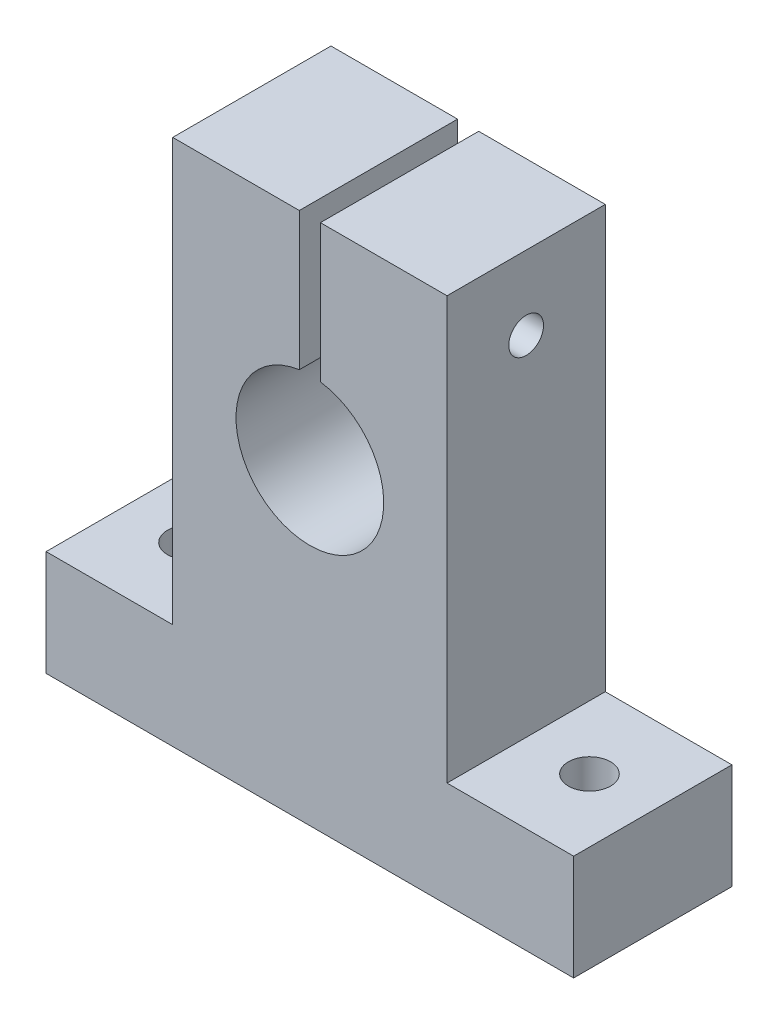
ISO-10303-21;
HEADER;
FILE_DESCRIPTION(('STEP AP214'),'2;1');
FILE_NAME('part.step','',(''),(''),'','','');
FILE_SCHEMA(('AUTOMOTIVE_DESIGN { 1 0 10303 214 1 1 1 1 }'));
ENDSEC;
DATA;
#1=APPLICATION_CONTEXT('core data for automotive mechanical design processes');
#2=APPLICATION_PROTOCOL_DEFINITION('international standard','automotive_design',2000,#1);
#3=PRODUCT_CONTEXT('',#1,'mechanical');
#4=PRODUCT('Part','Part','',(#3));
#5=PRODUCT_RELATED_PRODUCT_CATEGORY('part','',(#4));
#6=PRODUCT_DEFINITION_FORMATION('','',#4);
#7=PRODUCT_DEFINITION_CONTEXT('part definition',#1,'design');
#8=PRODUCT_DEFINITION('design','',#6,#7);
#9=PRODUCT_DEFINITION_SHAPE('','',#8);
#10=(LENGTH_UNIT() NAMED_UNIT(*) SI_UNIT(.MILLI.,.METRE.));
#11=(NAMED_UNIT(*) PLANE_ANGLE_UNIT() SI_UNIT($,.RADIAN.));
#12=(NAMED_UNIT(*) SI_UNIT($,.STERADIAN.) SOLID_ANGLE_UNIT());
#13=UNCERTAINTY_MEASURE_WITH_UNIT(LENGTH_MEASURE(1.E-05),#10,'distance_accuracy_value','');
#14=(GEOMETRIC_REPRESENTATION_CONTEXT(3) GLOBAL_UNCERTAINTY_ASSIGNED_CONTEXT((#13)) GLOBAL_UNIT_ASSIGNED_CONTEXT((#10,
#11,#12)) REPRESENTATION_CONTEXT('',''));
#15=CARTESIAN_POINT('',(0.,0.,0.));
#16=DIRECTION('',(0.,0.,1.));
#17=DIRECTION('',(1.,0.,0.));
#18=AXIS2_PLACEMENT_3D('',#15,#16,#17);
#19=CARTESIAN_POINT('',(0.,-40.,15.));
#20=DIRECTION('',(-1.,0.,0.));
#21=DIRECTION('',(0.,0.,1.));
#22=AXIS2_PLACEMENT_3D('',#19,#20,#21);
#23=PLANE('',#22);
#24=DIRECTION('',(0.,1.,0.));
#25=VECTOR('',#24,1.);
#26=CARTESIAN_POINT('',(0.,-40.,0.));
#27=LINE('',#26,#25);
#28=CARTESIAN_POINT('',(0.,-40.,0.));
#29=VERTEX_POINT('',#28);
#30=CARTESIAN_POINT('',(0.,0.,0.));
#31=VERTEX_POINT('',#30);
#32=EDGE_CURVE('E174',#29,#31,#27,.T.);
#33=ORIENTED_EDGE('',*,*,#32,.T.);
#34=DIRECTION('',(0.,0.,-1.));
#35=VECTOR('',#34,1.);
#36=CARTESIAN_POINT('',(0.,0.,15.));
#37=LINE('',#36,#35);
#38=CARTESIAN_POINT('',(0.,0.,15.));
#39=VERTEX_POINT('',#38);
#40=EDGE_CURVE('E210',#39,#31,#37,.T.);
#41=ORIENTED_EDGE('',*,*,#40,.F.);
#42=DIRECTION('',(0.,1.,0.));
#43=VECTOR('',#42,1.);
#44=CARTESIAN_POINT('',(0.,-40.,15.));
#45=LINE('',#44,#43);
#46=CARTESIAN_POINT('',(0.,-40.,15.));
#47=VERTEX_POINT('',#46);
#48=EDGE_CURVE('E233',#47,#39,#45,.T.);
#49=ORIENTED_EDGE('',*,*,#48,.F.);
#50=DIRECTION('',(0.,0.,-1.));
#51=VECTOR('',#50,1.);
#52=CARTESIAN_POINT('',(0.,-40.,15.));
#53=LINE('',#52,#51);
#54=EDGE_CURVE('E56',#47,#29,#53,.T.);
#55=ORIENTED_EDGE('',*,*,#54,.T.);
#56=EDGE_LOOP('',(#33,#41,#49,#55));
#57=FACE_BOUND('',#56,.T.);
#58=CARTESIAN_POINT('',(0.,-7.,7.5));
#59=DIRECTION('',(1.,0.,0.));
#60=DIRECTION('',(0.,0.,-1.));
#61=AXIS2_PLACEMENT_3D('',#58,#59,#60);
#62=CIRCLE('',#61,1.65);
#63=CARTESIAN_POINT('',(0.,-7.,5.85));
#64=VERTEX_POINT('',#63);
#65=EDGE_CURVE('E327',#64,#64,#62,.T.);
#66=ORIENTED_EDGE('',*,*,#65,.F.);
#67=EDGE_LOOP('',(#66));
#68=FACE_BOUND('',#67,.T.);
#69=ADVANCED_FACE('F46',(#57,#68),#23,.F.);
#70=CARTESIAN_POINT('',(12.,-50.,15.));
#71=DIRECTION('',(-1.,0.,0.));
#72=DIRECTION('',(0.,0.,1.));
#73=AXIS2_PLACEMENT_3D('',#70,#71,#72);
#74=PLANE('',#73);
#75=DIRECTION('',(0.,1.,0.));
#76=VECTOR('',#75,1.);
#77=CARTESIAN_POINT('',(12.,-50.,0.));
#78=LINE('',#77,#76);
#79=CARTESIAN_POINT('',(12.,-50.,0.));
#80=VERTEX_POINT('',#79);
#81=CARTESIAN_POINT('',(12.,-40.,0.));
#82=VERTEX_POINT('',#81);
#83=EDGE_CURVE('E169',#80,#82,#78,.T.);
#84=ORIENTED_EDGE('',*,*,#83,.T.);
#85=DIRECTION('',(0.,0.,-1.));
#86=VECTOR('',#85,1.);
#87=CARTESIAN_POINT('',(12.,-40.,15.));
#88=LINE('',#87,#86);
#89=CARTESIAN_POINT('',(12.,-40.,15.));
#90=VERTEX_POINT('',#89);
#91=EDGE_CURVE('E13',#90,#82,#88,.T.);
#92=ORIENTED_EDGE('',*,*,#91,.F.);
#93=DIRECTION('',(0.,1.,0.));
#94=VECTOR('',#93,1.);
#95=CARTESIAN_POINT('',(12.,-50.,15.));
#96=LINE('',#95,#94);
#97=CARTESIAN_POINT('',(12.,-50.,15.));
#98=VERTEX_POINT('',#97);
#99=EDGE_CURVE('E191',#98,#90,#96,.T.);
#100=ORIENTED_EDGE('',*,*,#99,.F.);
#101=DIRECTION('',(0.,0.,-1.));
#102=VECTOR('',#101,1.);
#103=CARTESIAN_POINT('',(12.,-50.,15.));
#104=LINE('',#103,#102);
#105=EDGE_CURVE('E165',#98,#80,#104,.T.);
#106=ORIENTED_EDGE('',*,*,#105,.T.);
#107=EDGE_LOOP('',(#84,#92,#100,#106));
#108=FACE_BOUND('',#107,.T.);
#109=ADVANCED_FACE('F48',(#108),#74,.F.);
#110=CARTESIAN_POINT('',(12.,-40.,15.));
#111=DIRECTION('',(0.,-1.,0.));
#112=DIRECTION('',(0.,0.,-1.));
#113=AXIS2_PLACEMENT_3D('',#110,#111,#112);
#114=PLANE('',#113);
#115=CARTESIAN_POINT('',(6.,-40.,7.5));
#116=DIRECTION('',(0.,1.,0.));
#117=DIRECTION('',(0.,0.,1.));
#118=AXIS2_PLACEMENT_3D('',#115,#116,#117);
#119=CIRCLE('',#118,2.);
#120=CARTESIAN_POINT('',(6.,-40.,9.5));
#121=VERTEX_POINT('',#120);
#122=EDGE_CURVE('E216',#121,#121,#119,.T.);
#123=ORIENTED_EDGE('',*,*,#122,.F.);
#124=EDGE_LOOP('',(#123));
#125=FACE_BOUND('',#124,.T.);
#126=DIRECTION('',(-1.,0.,0.));
#127=VECTOR('',#126,1.);
#128=CARTESIAN_POINT('',(12.,-40.,0.));
#129=LINE('',#128,#127);
#130=EDGE_CURVE('E172',#82,#29,#129,.T.);
#131=ORIENTED_EDGE('',*,*,#130,.T.);
#132=ORIENTED_EDGE('',*,*,#54,.F.);
#133=DIRECTION('',(-1.,0.,0.));
#134=VECTOR('',#133,1.);
#135=CARTESIAN_POINT('',(12.,-40.,15.));
#136=LINE('',#135,#134);
#137=EDGE_CURVE('E120',#90,#47,#136,.T.);
#138=ORIENTED_EDGE('',*,*,#137,.F.);
#139=ORIENTED_EDGE('',*,*,#91,.T.);
#140=EDGE_LOOP('',(#131,#132,#138,#139));
#141=FACE_BOUND('',#140,.T.);
#142=ADVANCED_FACE('F278',(#125,#141),#114,.F.);
#143=CARTESIAN_POINT('',(-12.,0.,15.));
#144=DIRECTION('',(0.,-1.,0.));
#145=DIRECTION('',(0.,0.,-1.));
#146=AXIS2_PLACEMENT_3D('',#143,#144,#145);
#147=PLANE('',#146);
#148=DIRECTION('',(-1.,0.,0.));
#149=VECTOR('',#148,1.);
#150=CARTESIAN_POINT('',(-12.,0.,0.));
#151=LINE('',#150,#149);
#152=CARTESIAN_POINT('',(-12.,0.,0.));
#153=VERTEX_POINT('',#152);
#154=EDGE_CURVE('E176',#31,#153,#151,.T.);
#155=ORIENTED_EDGE('',*,*,#154,.T.);
#156=DIRECTION('',(0.,0.,-1.));
#157=VECTOR('',#156,1.);
#158=CARTESIAN_POINT('',(-12.,0.,15.));
#159=LINE('',#158,#157);
#160=CARTESIAN_POINT('',(-12.,0.,15.));
#161=VERTEX_POINT('',#160);
#162=EDGE_CURVE('E207',#161,#153,#159,.T.);
#163=ORIENTED_EDGE('',*,*,#162,.F.);
#164=DIRECTION('',(-1.,0.,0.));
#165=VECTOR('',#164,1.);
#166=CARTESIAN_POINT('',(-12.,0.,15.));
#167=LINE('',#166,#165);
#168=EDGE_CURVE('E235',#39,#161,#167,.T.);
#169=ORIENTED_EDGE('',*,*,#168,.F.);
#170=ORIENTED_EDGE('',*,*,#40,.T.);
#171=EDGE_LOOP('',(#155,#163,#169,#170));
#172=FACE_BOUND('',#171,.T.);
#173=ADVANCED_FACE('F281',(#172),#147,.F.);
#174=CARTESIAN_POINT('',(-12.,0.,15.));
#175=DIRECTION('',(1.,0.,0.));
#176=DIRECTION('',(0.,1.,0.));
#177=AXIS2_PLACEMENT_3D('',#174,#175,#176);
#178=PLANE('',#177);
#179=CARTESIAN_POINT('',(-12.,-7.,7.5));
#180=DIRECTION('',(1.,0.,0.));
#181=DIRECTION('',(0.,1.,0.));
#182=AXIS2_PLACEMENT_3D('',#179,#180,#181);
#183=CIRCLE('',#182,1.65);
#184=CARTESIAN_POINT('',(-12.,-5.35,7.5));
#185=VERTEX_POINT('',#184);
#186=EDGE_CURVE('E324',#185,#185,#183,.T.);
#187=ORIENTED_EDGE('',*,*,#186,.T.);
#188=EDGE_LOOP('',(#187));
#189=FACE_BOUND('',#188,.T.);
#190=DIRECTION('',(0.,-1.,0.));
#191=VECTOR('',#190,1.);
#192=CARTESIAN_POINT('',(-12.,0.,0.));
#193=LINE('',#192,#191);
#194=CARTESIAN_POINT('',(-12.,-13.0717967697245,0.));
#195=VERTEX_POINT('',#194);
#196=EDGE_CURVE('E178',#153,#195,#193,.T.);
#197=ORIENTED_EDGE('',*,*,#196,.T.);
#198=DIRECTION('',(0.,0.,-1.));
#199=VECTOR('',#198,1.);
#200=CARTESIAN_POINT('',(-12.,-13.0717967697245,15.));
#201=LINE('',#200,#199);
#202=CARTESIAN_POINT('',(-12.,-13.0717967697245,15.));
#203=VERTEX_POINT('',#202);
#204=EDGE_CURVE('E204',#203,#195,#201,.T.);
#205=ORIENTED_EDGE('',*,*,#204,.F.);
#206=DIRECTION('',(0.,-1.,0.));
#207=VECTOR('',#206,1.);
#208=CARTESIAN_POINT('',(-12.,0.,15.));
#209=LINE('',#208,#207);
#210=EDGE_CURVE('E237',#161,#203,#209,.T.);
#211=ORIENTED_EDGE('',*,*,#210,.F.);
#212=ORIENTED_EDGE('',*,*,#162,.T.);
#213=EDGE_LOOP('',(#197,#205,#211,#212));
#214=FACE_BOUND('',#213,.T.);
#215=ADVANCED_FACE('F288',(#189,#214),#178,.F.);
#216=CARTESIAN_POINT('',(-13.,-20.,15.));
#217=DIRECTION('',(0.,0.,-1.));
#218=DIRECTION('',(-1.,0.,0.));
#219=AXIS2_PLACEMENT_3D('',#216,#217,#218);
#220=CYLINDRICAL_SURFACE('',#219,7.);
#221=CARTESIAN_POINT('',(-13.,-20.,0.));
#222=DIRECTION('',(0.,0.,-1.));
#223=DIRECTION('',(1.,0.,0.));
#224=AXIS2_PLACEMENT_3D('',#221,#222,#223);
#225=CIRCLE('',#224,7.);
#226=CARTESIAN_POINT('',(-14.,-13.0717967697245,0.));
#227=VERTEX_POINT('',#226);
#228=EDGE_CURVE('E180',#195,#227,#225,.T.);
#229=ORIENTED_EDGE('',*,*,#228,.T.);
#230=DIRECTION('',(0.,0.,-1.));
#231=VECTOR('',#230,1.);
#232=CARTESIAN_POINT('',(-14.,-13.0717967697245,15.));
#233=LINE('',#232,#231);
#234=CARTESIAN_POINT('',(-14.,-13.0717967697245,15.));
#235=VERTEX_POINT('',#234);
#236=EDGE_CURVE('E201',#235,#227,#233,.T.);
#237=ORIENTED_EDGE('',*,*,#236,.F.);
#238=CARTESIAN_POINT('',(-13.,-20.,15.));
#239=DIRECTION('',(0.,0.,-1.));
#240=DIRECTION('',(1.,0.,0.));
#241=AXIS2_PLACEMENT_3D('',#238,#239,#240);
#242=CIRCLE('',#241,7.);
#243=EDGE_CURVE('E239',#203,#235,#242,.T.);
#244=ORIENTED_EDGE('',*,*,#243,.F.);
#245=ORIENTED_EDGE('',*,*,#204,.T.);
#246=EDGE_LOOP('',(#229,#237,#244,#245));
#247=FACE_BOUND('',#246,.T.);
#248=ADVANCED_FACE('F303',(#247),#220,.F.);
#249=CARTESIAN_POINT('',(-14.,0.,15.));
#250=DIRECTION('',(-1.,0.,0.));
#251=DIRECTION('',(0.,-1.,0.));
#252=AXIS2_PLACEMENT_3D('',#249,#250,#251);
#253=PLANE('',#252);
#254=CARTESIAN_POINT('',(-14.,-7.,7.56985297052041));
#255=DIRECTION('',(-1.,0.,0.));
#256=DIRECTION('',(0.,-1.,0.));
#257=AXIS2_PLACEMENT_3D('',#254,#255,#256);
#258=CIRCLE('',#257,2.25);
#259=CARTESIAN_POINT('',(-14.,-9.25,7.56985297052041));
#260=VERTEX_POINT('',#259);
#261=EDGE_CURVE('E226',#260,#260,#258,.T.);
#262=ORIENTED_EDGE('',*,*,#261,.T.);
#263=EDGE_LOOP('',(#262));
#264=FACE_BOUND('',#263,.T.);
#265=DIRECTION('',(0.,1.,0.));
#266=VECTOR('',#265,1.);
#267=CARTESIAN_POINT('',(-14.,0.,0.));
#268=LINE('',#267,#266);
#269=CARTESIAN_POINT('',(-14.,0.,0.));
#270=VERTEX_POINT('',#269);
#271=EDGE_CURVE('E182',#227,#270,#268,.T.);
#272=ORIENTED_EDGE('',*,*,#271,.T.);
#273=DIRECTION('',(0.,0.,-1.));
#274=VECTOR('',#273,1.);
#275=CARTESIAN_POINT('',(-14.,0.,15.));
#276=LINE('',#275,#274);
#277=CARTESIAN_POINT('',(-14.,0.,15.));
#278=VERTEX_POINT('',#277);
#279=EDGE_CURVE('E198',#278,#270,#276,.T.);
#280=ORIENTED_EDGE('',*,*,#279,.F.);
#281=DIRECTION('',(0.,1.,0.));
#282=VECTOR('',#281,1.);
#283=CARTESIAN_POINT('',(-14.,0.,15.));
#284=LINE('',#283,#282);
#285=EDGE_CURVE('E241',#235,#278,#284,.T.);
#286=ORIENTED_EDGE('',*,*,#285,.F.);
#287=ORIENTED_EDGE('',*,*,#236,.T.);
#288=EDGE_LOOP('',(#272,#280,#286,#287));
#289=FACE_BOUND('',#288,.T.);
#290=ADVANCED_FACE('F306',(#264,#289),#253,.F.);
#291=CARTESIAN_POINT('',(-26.,0.,15.));
#292=DIRECTION('',(0.,-1.,0.));
#293=DIRECTION('',(0.,0.,-1.));
#294=AXIS2_PLACEMENT_3D('',#291,#292,#293);
#295=PLANE('',#294);
#296=DIRECTION('',(-1.,0.,0.));
#297=VECTOR('',#296,1.);
#298=CARTESIAN_POINT('',(-26.,0.,0.));
#299=LINE('',#298,#297);
#300=CARTESIAN_POINT('',(-26.,0.,0.));
#301=VERTEX_POINT('',#300);
#302=EDGE_CURVE('E184',#270,#301,#299,.T.);
#303=ORIENTED_EDGE('',*,*,#302,.T.);
#304=DIRECTION('',(0.,0.,-1.));
#305=VECTOR('',#304,1.);
#306=CARTESIAN_POINT('',(-26.,0.,15.));
#307=LINE('',#306,#305);
#308=CARTESIAN_POINT('',(-26.,0.,15.));
#309=VERTEX_POINT('',#308);
#310=EDGE_CURVE('E195',#309,#301,#307,.T.);
#311=ORIENTED_EDGE('',*,*,#310,.F.);
#312=DIRECTION('',(-1.,0.,0.));
#313=VECTOR('',#312,1.);
#314=CARTESIAN_POINT('',(-26.,0.,15.));
#315=LINE('',#314,#313);
#316=EDGE_CURVE('E243',#278,#309,#315,.T.);
#317=ORIENTED_EDGE('',*,*,#316,.F.);
#318=ORIENTED_EDGE('',*,*,#279,.T.);
#319=EDGE_LOOP('',(#303,#311,#317,#318));
#320=FACE_BOUND('',#319,.T.);
#321=ADVANCED_FACE('F249',(#320),#295,.F.);
#322=CARTESIAN_POINT('',(-26.,0.,15.));
#323=DIRECTION('',(1.,0.,0.));
#324=DIRECTION('',(0.,1.,0.));
#325=AXIS2_PLACEMENT_3D('',#322,#323,#324);
#326=PLANE('',#325);
#327=CARTESIAN_POINT('',(-26.,-7.,7.56985297052041));
#328=DIRECTION('',(-1.,0.,0.));
#329=DIRECTION('',(0.,0.,1.));
#330=AXIS2_PLACEMENT_3D('',#327,#328,#329);
#331=CIRCLE('',#330,2.25);
#332=CARTESIAN_POINT('',(-26.,-7.,9.81985297052041));
#333=VERTEX_POINT('',#332);
#334=EDGE_CURVE('E326',#333,#333,#331,.T.);
#335=ORIENTED_EDGE('',*,*,#334,.F.);
#336=EDGE_LOOP('',(#335));
#337=FACE_BOUND('',#336,.T.);
#338=DIRECTION('',(0.,-1.,0.));
#339=VECTOR('',#338,1.);
#340=CARTESIAN_POINT('',(-26.,0.,0.));
#341=LINE('',#340,#339);
#342=CARTESIAN_POINT('',(-26.,-40.,0.));
#343=VERTEX_POINT('',#342);
#344=EDGE_CURVE('E186',#301,#343,#341,.T.);
#345=ORIENTED_EDGE('',*,*,#344,.T.);
#346=DIRECTION('',(0.,0.,-1.));
#347=VECTOR('',#346,1.);
#348=CARTESIAN_POINT('',(-26.,-40.,15.));
#349=LINE('',#348,#347);
#350=CARTESIAN_POINT('',(-26.,-40.,15.));
#351=VERTEX_POINT('',#350);
#352=EDGE_CURVE('E160',#351,#343,#349,.T.);
#353=ORIENTED_EDGE('',*,*,#352,.F.);
#354=DIRECTION('',(0.,-1.,0.));
#355=VECTOR('',#354,1.);
#356=CARTESIAN_POINT('',(-26.,0.,15.));
#357=LINE('',#356,#355);
#358=EDGE_CURVE('E151',#309,#351,#357,.T.);
#359=ORIENTED_EDGE('',*,*,#358,.F.);
#360=ORIENTED_EDGE('',*,*,#310,.T.);
#361=EDGE_LOOP('',(#345,#353,#359,#360));
#362=FACE_BOUND('',#361,.T.);
#363=ADVANCED_FACE('F253',(#337,#362),#326,.F.);
#364=CARTESIAN_POINT('',(-26.,-40.,15.));
#365=DIRECTION('',(0.,-1.,0.));
#366=DIRECTION('',(1.,0.,0.));
#367=AXIS2_PLACEMENT_3D('',#364,#365,#366);
#368=PLANE('',#367);
#369=CARTESIAN_POINT('',(-32.,-40.,7.5));
#370=DIRECTION('',(0.,1.,0.));
#371=DIRECTION('',(0.,0.,1.));
#372=AXIS2_PLACEMENT_3D('',#369,#370,#371);
#373=CIRCLE('',#372,2.);
#374=CARTESIAN_POINT('',(-32.,-40.,9.5));
#375=VERTEX_POINT('',#374);
#376=EDGE_CURVE('E221',#375,#375,#373,.T.);
#377=ORIENTED_EDGE('',*,*,#376,.F.);
#378=EDGE_LOOP('',(#377));
#379=FACE_BOUND('',#378,.T.);
#380=DIRECTION('',(-1.,0.,0.));
#381=VECTOR('',#380,1.);
#382=CARTESIAN_POINT('',(-26.,-40.,0.));
#383=LINE('',#382,#381);
#384=CARTESIAN_POINT('',(-38.,-40.,0.));
#385=VERTEX_POINT('',#384);
#386=EDGE_CURVE('E159',#343,#385,#383,.T.);
#387=ORIENTED_EDGE('',*,*,#386,.T.);
#388=DIRECTION('',(0.,0.,-1.));
#389=VECTOR('',#388,1.);
#390=CARTESIAN_POINT('',(-38.,-40.,15.));
#391=LINE('',#390,#389);
#392=CARTESIAN_POINT('',(-38.,-40.,15.));
#393=VERTEX_POINT('',#392);
#394=EDGE_CURVE('E156',#393,#385,#391,.T.);
#395=ORIENTED_EDGE('',*,*,#394,.F.);
#396=DIRECTION('',(-1.,0.,0.));
#397=VECTOR('',#396,1.);
#398=CARTESIAN_POINT('',(-26.,-40.,15.));
#399=LINE('',#398,#397);
#400=EDGE_CURVE('E145',#351,#393,#399,.T.);
#401=ORIENTED_EDGE('',*,*,#400,.F.);
#402=ORIENTED_EDGE('',*,*,#352,.T.);
#403=EDGE_LOOP('',(#387,#395,#401,#402));
#404=FACE_BOUND('',#403,.T.);
#405=ADVANCED_FACE('F157',(#379,#404),#368,.F.);
#406=CARTESIAN_POINT('',(-38.,-40.,15.));
#407=DIRECTION('',(1.,0.,0.));
#408=DIRECTION('',(0.,0.,-1.));
#409=AXIS2_PLACEMENT_3D('',#406,#407,#408);
#410=PLANE('',#409);
#411=DIRECTION('',(0.,-1.,0.));
#412=VECTOR('',#411,1.);
#413=CARTESIAN_POINT('',(-38.,-40.,0.));
#414=LINE('',#413,#412);
#415=CARTESIAN_POINT('',(-38.,-50.,0.));
#416=VERTEX_POINT('',#415);
#417=EDGE_CURVE('E106',#385,#416,#414,.T.);
#418=ORIENTED_EDGE('',*,*,#417,.T.);
#419=DIRECTION('',(0.,0.,-1.));
#420=VECTOR('',#419,1.);
#421=CARTESIAN_POINT('',(-38.,-50.,15.));
#422=LINE('',#421,#420);
#423=CARTESIAN_POINT('',(-38.,-50.,15.));
#424=VERTEX_POINT('',#423);
#425=EDGE_CURVE('E161',#424,#416,#422,.T.);
#426=ORIENTED_EDGE('',*,*,#425,.F.);
#427=DIRECTION('',(0.,-1.,0.));
#428=VECTOR('',#427,1.);
#429=CARTESIAN_POINT('',(-38.,-40.,15.));
#430=LINE('',#429,#428);
#431=EDGE_CURVE('E149',#393,#424,#430,.T.);
#432=ORIENTED_EDGE('',*,*,#431,.F.);
#433=ORIENTED_EDGE('',*,*,#394,.T.);
#434=EDGE_LOOP('',(#418,#426,#432,#433));
#435=FACE_BOUND('',#434,.T.);
#436=ADVANCED_FACE('F163',(#435),#410,.F.);
#437=CARTESIAN_POINT('',(-38.,-50.,15.));
#438=DIRECTION('',(0.,1.,0.));
#439=DIRECTION('',(0.,0.,1.));
#440=AXIS2_PLACEMENT_3D('',#437,#438,#439);
#441=PLANE('',#440);
#442=CARTESIAN_POINT('',(6.,-50.,7.5));
#443=DIRECTION('',(0.,1.,0.));
#444=DIRECTION('',(0.,0.,1.));
#445=AXIS2_PLACEMENT_3D('',#442,#443,#444);
#446=CIRCLE('',#445,2.);
#447=CARTESIAN_POINT('',(6.,-50.,9.5));
#448=VERTEX_POINT('',#447);
#449=EDGE_CURVE('E50',#448,#448,#446,.T.);
#450=ORIENTED_EDGE('',*,*,#449,.T.);
#451=EDGE_LOOP('',(#450));
#452=FACE_BOUND('',#451,.T.);
#453=CARTESIAN_POINT('',(-32.,-50.,7.5));
#454=DIRECTION('',(0.,1.,0.));
#455=DIRECTION('',(0.,0.,1.));
#456=AXIS2_PLACEMENT_3D('',#453,#454,#455);
#457=CIRCLE('',#456,2.);
#458=CARTESIAN_POINT('',(-32.,-50.,9.5));
#459=VERTEX_POINT('',#458);
#460=EDGE_CURVE('E214',#459,#459,#457,.T.);
#461=ORIENTED_EDGE('',*,*,#460,.T.);
#462=EDGE_LOOP('',(#461));
#463=FACE_BOUND('',#462,.T.);
#464=DIRECTION('',(1.,0.,0.));
#465=VECTOR('',#464,1.);
#466=CARTESIAN_POINT('',(-38.,-50.,0.));
#467=LINE('',#466,#465);
#468=EDGE_CURVE('E112',#416,#80,#467,.T.);
#469=ORIENTED_EDGE('',*,*,#468,.T.);
#470=ORIENTED_EDGE('',*,*,#105,.F.);
#471=DIRECTION('',(1.,0.,0.));
#472=VECTOR('',#471,1.);
#473=CARTESIAN_POINT('',(-38.,-50.,15.));
#474=LINE('',#473,#472);
#475=EDGE_CURVE('E65',#424,#98,#474,.T.);
#476=ORIENTED_EDGE('',*,*,#475,.F.);
#477=ORIENTED_EDGE('',*,*,#425,.T.);
#478=EDGE_LOOP('',(#469,#470,#476,#477));
#479=FACE_BOUND('',#478,.T.);
#480=ADVANCED_FACE('F261',(#452,#463,#479),#441,.F.);
#481=CARTESIAN_POINT('',(-13.,-20.,15.));
#482=DIRECTION('',(0.,0.,1.));
#483=DIRECTION('',(1.,0.,0.));
#484=AXIS2_PLACEMENT_3D('',#481,#482,#483);
#485=PLANE('',#484);
#486=ORIENTED_EDGE('',*,*,#99,.T.);
#487=ORIENTED_EDGE('',*,*,#137,.T.);
#488=ORIENTED_EDGE('',*,*,#48,.T.);
#489=ORIENTED_EDGE('',*,*,#168,.T.);
#490=ORIENTED_EDGE('',*,*,#210,.T.);
#491=ORIENTED_EDGE('',*,*,#243,.T.);
#492=ORIENTED_EDGE('',*,*,#285,.T.);
#493=ORIENTED_EDGE('',*,*,#316,.T.);
#494=ORIENTED_EDGE('',*,*,#358,.T.);
#495=ORIENTED_EDGE('',*,*,#400,.T.);
#496=ORIENTED_EDGE('',*,*,#431,.T.);
#497=ORIENTED_EDGE('',*,*,#475,.T.);
#498=EDGE_LOOP('',(#486,#487,#488,#489,#490,#491,#492,#493,#494,#495,#496,#497));
#499=FACE_BOUND('',#498,.T.);
#500=ADVANCED_FACE('F147',(#499),#485,.T.);
#501=CARTESIAN_POINT('',(-13.,-20.,0.));
#502=DIRECTION('',(0.,0.,1.));
#503=DIRECTION('',(1.,0.,0.));
#504=AXIS2_PLACEMENT_3D('',#501,#502,#503);
#505=PLANE('',#504);
#506=ORIENTED_EDGE('',*,*,#83,.F.);
#507=ORIENTED_EDGE('',*,*,#468,.F.);
#508=ORIENTED_EDGE('',*,*,#417,.F.);
#509=ORIENTED_EDGE('',*,*,#386,.F.);
#510=ORIENTED_EDGE('',*,*,#344,.F.);
#511=ORIENTED_EDGE('',*,*,#302,.F.);
#512=ORIENTED_EDGE('',*,*,#271,.F.);
#513=ORIENTED_EDGE('',*,*,#228,.F.);
#514=ORIENTED_EDGE('',*,*,#196,.F.);
#515=ORIENTED_EDGE('',*,*,#154,.F.);
#516=ORIENTED_EDGE('',*,*,#32,.F.);
#517=ORIENTED_EDGE('',*,*,#130,.F.);
#518=EDGE_LOOP('',(#506,#507,#508,#509,#510,#511,#512,#513,#514,#515,#516,#517));
#519=FACE_BOUND('',#518,.T.);
#520=ADVANCED_FACE('F256',(#519),#505,.F.);
#521=CARTESIAN_POINT('',(-32.,-55.,7.5));
#522=DIRECTION('',(0.,1.,0.));
#523=DIRECTION('',(0.,0.,1.));
#524=AXIS2_PLACEMENT_3D('',#521,#522,#523);
#525=CYLINDRICAL_SURFACE('',#524,2.);
#526=ORIENTED_EDGE('',*,*,#376,.T.);
#527=EDGE_LOOP('',(#526));
#528=FACE_BOUND('',#527,.T.);
#529=ORIENTED_EDGE('',*,*,#460,.F.);
#530=EDGE_LOOP('',(#529));
#531=FACE_BOUND('',#530,.T.);
#532=ADVANCED_FACE('F347',(#528,#531),#525,.F.);
#533=CARTESIAN_POINT('',(6.,-55.,7.5));
#534=DIRECTION('',(0.,1.,0.));
#535=DIRECTION('',(0.,0.,1.));
#536=AXIS2_PLACEMENT_3D('',#533,#534,#535);
#537=CYLINDRICAL_SURFACE('',#536,2.);
#538=ORIENTED_EDGE('',*,*,#122,.T.);
#539=EDGE_LOOP('',(#538));
#540=FACE_BOUND('',#539,.T.);
#541=ORIENTED_EDGE('',*,*,#449,.F.);
#542=EDGE_LOOP('',(#541));
#543=FACE_BOUND('',#542,.T.);
#544=ADVANCED_FACE('F341',(#540,#543),#537,.F.);
#545=CARTESIAN_POINT('',(-26.,-7.,7.56985297052041));
#546=DIRECTION('',(-1.,0.,0.));
#547=DIRECTION('',(0.,0.,1.));
#548=AXIS2_PLACEMENT_3D('',#545,#546,#547);
#549=CYLINDRICAL_SURFACE('',#548,2.25);
#550=ORIENTED_EDGE('',*,*,#261,.F.);
#551=EDGE_LOOP('',(#550));
#552=FACE_BOUND('',#551,.T.);
#553=ORIENTED_EDGE('',*,*,#334,.T.);
#554=EDGE_LOOP('',(#553));
#555=FACE_BOUND('',#554,.T.);
#556=ADVANCED_FACE('F336',(#552,#555),#549,.F.);
#557=CARTESIAN_POINT('',(0.,-7.,7.5));
#558=DIRECTION('',(1.,0.,0.));
#559=DIRECTION('',(0.,0.,-1.));
#560=AXIS2_PLACEMENT_3D('',#557,#558,#559);
#561=CYLINDRICAL_SURFACE('',#560,1.65);
#562=ORIENTED_EDGE('',*,*,#186,.F.);
#563=EDGE_LOOP('',(#562));
#564=FACE_BOUND('',#563,.T.);
#565=ORIENTED_EDGE('',*,*,#65,.T.);
#566=EDGE_LOOP('',(#565));
#567=FACE_BOUND('',#566,.T.);
#568=ADVANCED_FACE('F334',(#564,#567),#561,.F.);
#569=CLOSED_SHELL('',(#69,#109,#142,#173,#215,#248,#290,#321,#363,#405,#436,#480,#500,#520,#532,
#544,#556,#568));
#570=MANIFOLD_SOLID_BREP('B2',#569);
#571=ADVANCED_BREP_SHAPE_REPRESENTATION('',(#18,#570),#14);
#572=SHAPE_DEFINITION_REPRESENTATION(#9,#571);
ENDSEC;
END-ISO-10303-21;
